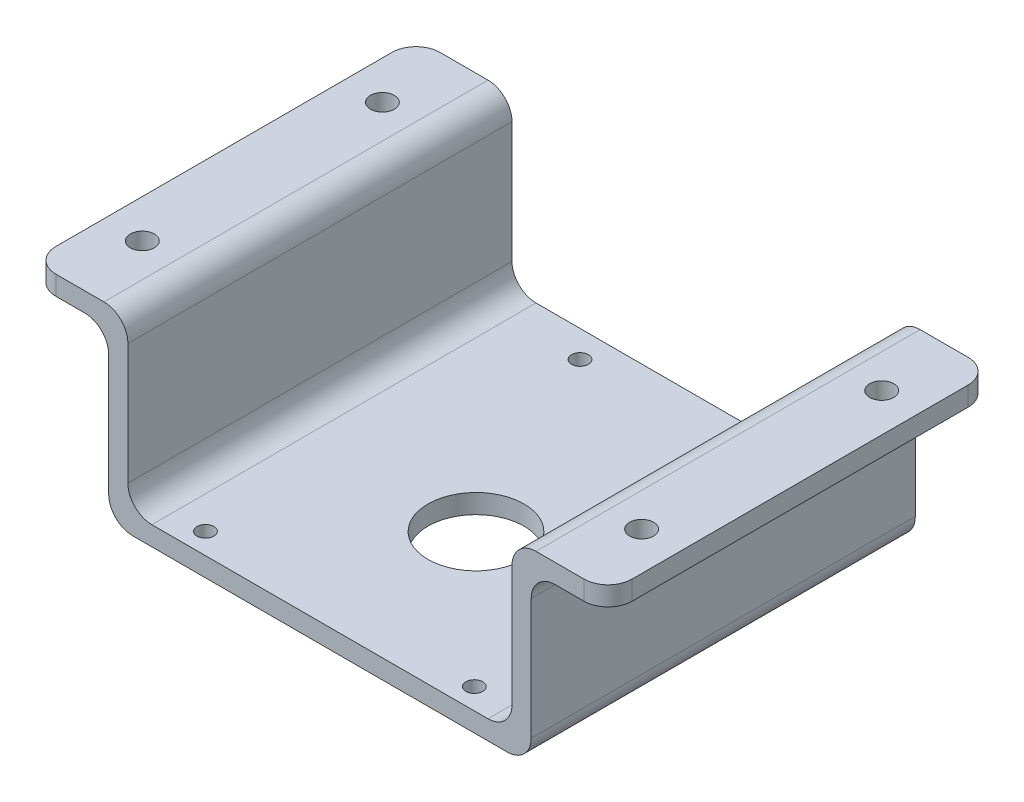
ISO-10303-21;
HEADER;
FILE_DESCRIPTION(('STEP AP214'),'2;1');
FILE_NAME('part.step','',(''),(''),'','','');
FILE_SCHEMA(('AUTOMOTIVE_DESIGN { 1 0 10303 214 1 1 1 1 }'));
ENDSEC;
DATA;
#1=APPLICATION_CONTEXT('core data for automotive mechanical design processes');
#2=APPLICATION_PROTOCOL_DEFINITION('international standard','automotive_design',2000,#1);
#3=PRODUCT_CONTEXT('',#1,'mechanical');
#4=PRODUCT('Part','Part','',(#3));
#5=PRODUCT_RELATED_PRODUCT_CATEGORY('part','',(#4));
#6=PRODUCT_DEFINITION_FORMATION('','',#4);
#7=PRODUCT_DEFINITION_CONTEXT('part definition',#1,'design');
#8=PRODUCT_DEFINITION('design','',#6,#7);
#9=PRODUCT_DEFINITION_SHAPE('','',#8);
#10=(LENGTH_UNIT() NAMED_UNIT(*) SI_UNIT(.MILLI.,.METRE.));
#11=(NAMED_UNIT(*) PLANE_ANGLE_UNIT() SI_UNIT($,.RADIAN.));
#12=(NAMED_UNIT(*) SI_UNIT($,.STERADIAN.) SOLID_ANGLE_UNIT());
#13=UNCERTAINTY_MEASURE_WITH_UNIT(LENGTH_MEASURE(1.E-05),#10,'distance_accuracy_value','');
#14=(GEOMETRIC_REPRESENTATION_CONTEXT(3) GLOBAL_UNCERTAINTY_ASSIGNED_CONTEXT((#13)) GLOBAL_UNIT_ASSIGNED_CONTEXT((#10,
#11,#12)) REPRESENTATION_CONTEXT('',''));
#15=CARTESIAN_POINT('',(0.,0.,0.));
#16=DIRECTION('',(0.,0.,1.));
#17=DIRECTION('',(1.,0.,0.));
#18=AXIS2_PLACEMENT_3D('',#15,#16,#17);
#19=CARTESIAN_POINT('',(40.,4.,40.));
#20=DIRECTION('',(0.,0.,-1.));
#21=DIRECTION('',(-1.,0.,0.));
#22=AXIS2_PLACEMENT_3D('',#19,#20,#21);
#23=PLANE('',#22);
#24=DIRECTION('',(-1.,0.,0.));
#25=VECTOR('',#24,1.);
#26=CARTESIAN_POINT('',(44.,39.2,40.));
#27=LINE('',#26,#25);
#28=CARTESIAN_POINT('',(55.,39.2,40.));
#29=VERTEX_POINT('',#28);
#30=CARTESIAN_POINT('',(45.,39.2,40.));
#31=VERTEX_POINT('',#30);
#32=EDGE_CURVE('E410',#29,#31,#27,.T.);
#33=ORIENTED_EDGE('',*,*,#32,.T.);
#34=CARTESIAN_POINT('',(45.,34.2,40.));
#35=DIRECTION('',(0.,0.,-1.));
#36=DIRECTION('',(-1.,0.,0.));
#37=AXIS2_PLACEMENT_3D('',#34,#35,#36);
#38=CIRCLE('',#37,5.);
#39=CARTESIAN_POINT('',(40.,34.2,40.));
#40=VERTEX_POINT('',#39);
#41=EDGE_CURVE('E329',#31,#40,#38,.F.);
#42=ORIENTED_EDGE('',*,*,#41,.T.);
#43=DIRECTION('',(0.,1.,0.));
#44=VECTOR('',#43,1.);
#45=CARTESIAN_POINT('',(40.,0.,40.));
#46=LINE('',#45,#44);
#47=CARTESIAN_POINT('',(40.,9.,40.));
#48=VERTEX_POINT('',#47);
#49=EDGE_CURVE('E399',#48,#40,#46,.T.);
#50=ORIENTED_EDGE('',*,*,#49,.F.);
#51=CARTESIAN_POINT('',(35.,9.,40.));
#52=DIRECTION('',(0.,0.,-1.));
#53=DIRECTION('',(-1.,0.,0.));
#54=AXIS2_PLACEMENT_3D('',#51,#52,#53);
#55=CIRCLE('',#54,5.);
#56=CARTESIAN_POINT('',(35.,4.,40.));
#57=VERTEX_POINT('',#56);
#58=EDGE_CURVE('E368',#48,#57,#55,.T.);
#59=ORIENTED_EDGE('',*,*,#58,.T.);
#60=DIRECTION('',(1.,0.,0.));
#61=VECTOR('',#60,1.);
#62=CARTESIAN_POINT('',(40.,4.,40.));
#63=LINE('',#62,#61);
#64=CARTESIAN_POINT('',(-35.,4.,40.));
#65=VERTEX_POINT('',#64);
#66=EDGE_CURVE('E261',#65,#57,#63,.T.);
#67=ORIENTED_EDGE('',*,*,#66,.F.);
#68=CARTESIAN_POINT('',(-35.,9.,40.));
#69=DIRECTION('',(0.,0.,-1.));
#70=DIRECTION('',(-1.,0.,0.));
#71=AXIS2_PLACEMENT_3D('',#68,#69,#70);
#72=CIRCLE('',#71,5.);
#73=CARTESIAN_POINT('',(-40.,9.,40.));
#74=VERTEX_POINT('',#73);
#75=EDGE_CURVE('E40',#65,#74,#72,.T.);
#76=ORIENTED_EDGE('',*,*,#75,.T.);
#77=DIRECTION('',(0.,1.,0.));
#78=VECTOR('',#77,1.);
#79=CARTESIAN_POINT('',(-40.,0.,40.));
#80=LINE('',#79,#78);
#81=CARTESIAN_POINT('',(-40.,34.2,40.));
#82=VERTEX_POINT('',#81);
#83=EDGE_CURVE('E228',#74,#82,#80,.T.);
#84=ORIENTED_EDGE('',*,*,#83,.T.);
#85=CARTESIAN_POINT('',(-45.,34.2,40.));
#86=DIRECTION('',(0.,0.,-1.));
#87=DIRECTION('',(-1.,0.,0.));
#88=AXIS2_PLACEMENT_3D('',#85,#86,#87);
#89=CIRCLE('',#88,5.);
#90=CARTESIAN_POINT('',(-45.,39.2,40.));
#91=VERTEX_POINT('',#90);
#92=EDGE_CURVE('E204',#82,#91,#89,.F.);
#93=ORIENTED_EDGE('',*,*,#92,.T.);
#94=DIRECTION('',(1.,0.,0.));
#95=VECTOR('',#94,1.);
#96=CARTESIAN_POINT('',(-44.,39.2,40.));
#97=LINE('',#96,#95);
#98=CARTESIAN_POINT('',(-55.,39.2,40.));
#99=VERTEX_POINT('',#98);
#100=EDGE_CURVE('E226',#99,#91,#97,.T.);
#101=ORIENTED_EDGE('',*,*,#100,.F.);
#102=DIRECTION('',(0.,1.,0.));
#103=VECTOR('',#102,1.);
#104=CARTESIAN_POINT('',(-55.,35.2,40.));
#105=LINE('',#104,#103);
#106=CARTESIAN_POINT('',(-55.,35.2,40.));
#107=VERTEX_POINT('',#106);
#108=EDGE_CURVE('E322',#99,#107,#105,.F.);
#109=ORIENTED_EDGE('',*,*,#108,.T.);
#110=DIRECTION('',(1.,0.,0.));
#111=VECTOR('',#110,1.);
#112=CARTESIAN_POINT('',(-40.,35.2,40.));
#113=LINE('',#112,#111);
#114=CARTESIAN_POINT('',(-49.,35.2,40.));
#115=VERTEX_POINT('',#114);
#116=EDGE_CURVE('E400',#107,#115,#113,.T.);
#117=ORIENTED_EDGE('',*,*,#116,.T.);
#118=CARTESIAN_POINT('',(-49.,30.2,40.));
#119=DIRECTION('',(0.,0.,-1.));
#120=DIRECTION('',(-1.,0.,0.));
#121=AXIS2_PLACEMENT_3D('',#118,#119,#120);
#122=CIRCLE('',#121,5.);
#123=CARTESIAN_POINT('',(-44.,30.2,40.));
#124=VERTEX_POINT('',#123);
#125=EDGE_CURVE('E222',#115,#124,#122,.T.);
#126=ORIENTED_EDGE('',*,*,#125,.T.);
#127=DIRECTION('',(0.,1.,0.));
#128=VECTOR('',#127,1.);
#129=CARTESIAN_POINT('',(-44.,0.,40.));
#130=LINE('',#129,#128);
#131=CARTESIAN_POINT('',(-44.,5.,40.));
#132=VERTEX_POINT('',#131);
#133=EDGE_CURVE('E212',#132,#124,#130,.T.);
#134=ORIENTED_EDGE('',*,*,#133,.F.);
#135=CARTESIAN_POINT('',(-39.,5.,40.));
#136=DIRECTION('',(0.,0.,-1.));
#137=DIRECTION('',(-1.,0.,0.));
#138=AXIS2_PLACEMENT_3D('',#135,#136,#137);
#139=CIRCLE('',#138,5.);
#140=CARTESIAN_POINT('',(-39.,0.,40.));
#141=VERTEX_POINT('',#140);
#142=EDGE_CURVE('E194',#132,#141,#139,.F.);
#143=ORIENTED_EDGE('',*,*,#142,.T.);
#144=DIRECTION('',(1.,0.,0.));
#145=VECTOR('',#144,1.);
#146=CARTESIAN_POINT('',(40.,0.,40.));
#147=LINE('',#146,#145);
#148=CARTESIAN_POINT('',(39.,0.,40.));
#149=VERTEX_POINT('',#148);
#150=EDGE_CURVE('E256',#141,#149,#147,.T.);
#151=ORIENTED_EDGE('',*,*,#150,.T.);
#152=CARTESIAN_POINT('',(39.,5.,40.));
#153=DIRECTION('',(0.,0.,-1.));
#154=DIRECTION('',(-1.,0.,0.));
#155=AXIS2_PLACEMENT_3D('',#152,#153,#154);
#156=CIRCLE('',#155,5.);
#157=CARTESIAN_POINT('',(44.,5.,40.));
#158=VERTEX_POINT('',#157);
#159=EDGE_CURVE('E205',#149,#158,#156,.F.);
#160=ORIENTED_EDGE('',*,*,#159,.T.);
#161=DIRECTION('',(0.,1.,0.));
#162=VECTOR('',#161,1.);
#163=CARTESIAN_POINT('',(44.,0.,40.));
#164=LINE('',#163,#162);
#165=CARTESIAN_POINT('',(44.,30.2,40.));
#166=VERTEX_POINT('',#165);
#167=EDGE_CURVE('E407',#158,#166,#164,.T.);
#168=ORIENTED_EDGE('',*,*,#167,.T.);
#169=CARTESIAN_POINT('',(49.,30.2,40.));
#170=DIRECTION('',(0.,0.,-1.));
#171=DIRECTION('',(-1.,0.,0.));
#172=AXIS2_PLACEMENT_3D('',#169,#170,#171);
#173=CIRCLE('',#172,5.);
#174=CARTESIAN_POINT('',(49.,35.2,40.));
#175=VERTEX_POINT('',#174);
#176=EDGE_CURVE('E362',#166,#175,#173,.T.);
#177=ORIENTED_EDGE('',*,*,#176,.T.);
#178=DIRECTION('',(-1.,0.,0.));
#179=VECTOR('',#178,1.);
#180=CARTESIAN_POINT('',(40.,35.2,40.));
#181=LINE('',#180,#179);
#182=CARTESIAN_POINT('',(55.,35.2,40.));
#183=VERTEX_POINT('',#182);
#184=EDGE_CURVE('E433',#183,#175,#181,.T.);
#185=ORIENTED_EDGE('',*,*,#184,.F.);
#186=DIRECTION('',(0.,1.,0.));
#187=VECTOR('',#186,1.);
#188=CARTESIAN_POINT('',(55.,4.,40.));
#189=LINE('',#188,#187);
#190=EDGE_CURVE('E324',#183,#29,#189,.T.);
#191=ORIENTED_EDGE('',*,*,#190,.T.);
#192=EDGE_LOOP('',(#33,#42,#50,#59,#67,#76,#84,#93,#101,#109,#117,#126,#134,#143,#151,#160,#168,
#177,#185,#191));
#193=FACE_BOUND('',#192,.T.);
#194=ADVANCED_FACE('F32',(#193),#23,.F.);
#195=CARTESIAN_POINT('',(40.,4.,-40.));
#196=DIRECTION('',(0.,0.,1.));
#197=DIRECTION('',(1.,0.,0.));
#198=AXIS2_PLACEMENT_3D('',#195,#196,#197);
#199=PLANE('',#198);
#200=DIRECTION('',(0.,-1.,0.));
#201=VECTOR('',#200,1.);
#202=CARTESIAN_POINT('',(40.,0.,-40.));
#203=LINE('',#202,#201);
#204=CARTESIAN_POINT('',(40.,34.2,-40.));
#205=VERTEX_POINT('',#204);
#206=CARTESIAN_POINT('',(40.,9.,-40.));
#207=VERTEX_POINT('',#206);
#208=EDGE_CURVE('E393',#205,#207,#203,.T.);
#209=ORIENTED_EDGE('',*,*,#208,.F.);
#210=CARTESIAN_POINT('',(45.,34.2,-40.));
#211=DIRECTION('',(0.,0.,1.));
#212=DIRECTION('',(1.,0.,0.));
#213=AXIS2_PLACEMENT_3D('',#210,#211,#212);
#214=CIRCLE('',#213,5.);
#215=CARTESIAN_POINT('',(45.,39.2,-40.));
#216=VERTEX_POINT('',#215);
#217=EDGE_CURVE('E314',#205,#216,#214,.F.);
#218=ORIENTED_EDGE('',*,*,#217,.T.);
#219=DIRECTION('',(-1.,0.,0.));
#220=VECTOR('',#219,1.);
#221=CARTESIAN_POINT('',(44.,39.2,-40.));
#222=LINE('',#221,#220);
#223=CARTESIAN_POINT('',(55.,39.2,-40.));
#224=VERTEX_POINT('',#223);
#225=EDGE_CURVE('E235',#224,#216,#222,.T.);
#226=ORIENTED_EDGE('',*,*,#225,.F.);
#227=DIRECTION('',(0.,1.,0.));
#228=VECTOR('',#227,1.);
#229=CARTESIAN_POINT('',(55.,4.,-40.));
#230=LINE('',#229,#228);
#231=CARTESIAN_POINT('',(55.,35.2,-40.));
#232=VERTEX_POINT('',#231);
#233=EDGE_CURVE('E306',#224,#232,#230,.F.);
#234=ORIENTED_EDGE('',*,*,#233,.T.);
#235=DIRECTION('',(1.,0.,0.));
#236=VECTOR('',#235,1.);
#237=CARTESIAN_POINT('',(40.,35.2,-40.));
#238=LINE('',#237,#236);
#239=CARTESIAN_POINT('',(49.,35.2,-40.));
#240=VERTEX_POINT('',#239);
#241=EDGE_CURVE('E445',#240,#232,#238,.T.);
#242=ORIENTED_EDGE('',*,*,#241,.F.);
#243=CARTESIAN_POINT('',(49.,30.2,-40.));
#244=DIRECTION('',(0.,0.,1.));
#245=DIRECTION('',(1.,0.,0.));
#246=AXIS2_PLACEMENT_3D('',#243,#244,#245);
#247=CIRCLE('',#246,5.);
#248=CARTESIAN_POINT('',(44.,30.2,-40.));
#249=VERTEX_POINT('',#248);
#250=EDGE_CURVE('E364',#240,#249,#247,.T.);
#251=ORIENTED_EDGE('',*,*,#250,.T.);
#252=DIRECTION('',(0.,-1.,0.));
#253=VECTOR('',#252,1.);
#254=CARTESIAN_POINT('',(44.,0.,-40.));
#255=LINE('',#254,#253);
#256=CARTESIAN_POINT('',(44.,5.,-40.));
#257=VERTEX_POINT('',#256);
#258=EDGE_CURVE('E402',#249,#257,#255,.T.);
#259=ORIENTED_EDGE('',*,*,#258,.T.);
#260=CARTESIAN_POINT('',(39.,5.,-40.));
#261=DIRECTION('',(0.,0.,1.));
#262=DIRECTION('',(1.,0.,0.));
#263=AXIS2_PLACEMENT_3D('',#260,#261,#262);
#264=CIRCLE('',#263,5.);
#265=CARTESIAN_POINT('',(39.,0.,-40.));
#266=VERTEX_POINT('',#265);
#267=EDGE_CURVE('E308',#257,#266,#264,.F.);
#268=ORIENTED_EDGE('',*,*,#267,.T.);
#269=DIRECTION('',(-1.,0.,0.));
#270=VECTOR('',#269,1.);
#271=CARTESIAN_POINT('',(40.,0.,-40.));
#272=LINE('',#271,#270);
#273=CARTESIAN_POINT('',(-39.,0.,-40.));
#274=VERTEX_POINT('',#273);
#275=EDGE_CURVE('E264',#266,#274,#272,.T.);
#276=ORIENTED_EDGE('',*,*,#275,.T.);
#277=CARTESIAN_POINT('',(-39.,5.,-40.));
#278=DIRECTION('',(0.,0.,1.));
#279=DIRECTION('',(1.,0.,0.));
#280=AXIS2_PLACEMENT_3D('',#277,#278,#279);
#281=CIRCLE('',#280,5.);
#282=CARTESIAN_POINT('',(-44.,5.,-40.));
#283=VERTEX_POINT('',#282);
#284=EDGE_CURVE('E310',#274,#283,#281,.F.);
#285=ORIENTED_EDGE('',*,*,#284,.T.);
#286=DIRECTION('',(0.,-1.,0.));
#287=VECTOR('',#286,1.);
#288=CARTESIAN_POINT('',(-44.,0.,-40.));
#289=LINE('',#288,#287);
#290=CARTESIAN_POINT('',(-44.,30.2,-40.));
#291=VERTEX_POINT('',#290);
#292=EDGE_CURVE('E215',#291,#283,#289,.T.);
#293=ORIENTED_EDGE('',*,*,#292,.F.);
#294=CARTESIAN_POINT('',(-49.,30.2,-40.));
#295=DIRECTION('',(0.,0.,1.));
#296=DIRECTION('',(1.,0.,0.));
#297=AXIS2_PLACEMENT_3D('',#294,#295,#296);
#298=CIRCLE('',#297,5.);
#299=CARTESIAN_POINT('',(-49.,35.2,-40.));
#300=VERTEX_POINT('',#299);
#301=EDGE_CURVE('E359',#291,#300,#298,.T.);
#302=ORIENTED_EDGE('',*,*,#301,.T.);
#303=DIRECTION('',(-1.,0.,0.));
#304=VECTOR('',#303,1.);
#305=CARTESIAN_POINT('',(-40.,35.2,-40.));
#306=LINE('',#305,#304);
#307=CARTESIAN_POINT('',(-55.,35.2,-40.));
#308=VERTEX_POINT('',#307);
#309=EDGE_CURVE('E454',#300,#308,#306,.T.);
#310=ORIENTED_EDGE('',*,*,#309,.T.);
#311=DIRECTION('',(0.,1.,0.));
#312=VECTOR('',#311,1.);
#313=CARTESIAN_POINT('',(-55.,39.2,-40.));
#314=LINE('',#313,#312);
#315=CARTESIAN_POINT('',(-55.,39.2,-40.));
#316=VERTEX_POINT('',#315);
#317=EDGE_CURVE('E303',#308,#316,#314,.T.);
#318=ORIENTED_EDGE('',*,*,#317,.T.);
#319=DIRECTION('',(1.,0.,0.));
#320=VECTOR('',#319,1.);
#321=CARTESIAN_POINT('',(-44.,39.2,-40.));
#322=LINE('',#321,#320);
#323=CARTESIAN_POINT('',(-45.,39.2,-40.));
#324=VERTEX_POINT('',#323);
#325=EDGE_CURVE('E223',#316,#324,#322,.T.);
#326=ORIENTED_EDGE('',*,*,#325,.T.);
#327=CARTESIAN_POINT('',(-45.,34.2,-40.));
#328=DIRECTION('',(0.,0.,1.));
#329=DIRECTION('',(1.,0.,0.));
#330=AXIS2_PLACEMENT_3D('',#327,#328,#329);
#331=CIRCLE('',#330,5.);
#332=CARTESIAN_POINT('',(-40.,34.2,-40.));
#333=VERTEX_POINT('',#332);
#334=EDGE_CURVE('E312',#324,#333,#331,.F.);
#335=ORIENTED_EDGE('',*,*,#334,.T.);
#336=DIRECTION('',(0.,-1.,0.));
#337=VECTOR('',#336,1.);
#338=CARTESIAN_POINT('',(-40.,0.,-40.));
#339=LINE('',#338,#337);
#340=CARTESIAN_POINT('',(-40.,9.,-40.));
#341=VERTEX_POINT('',#340);
#342=EDGE_CURVE('E232',#333,#341,#339,.T.);
#343=ORIENTED_EDGE('',*,*,#342,.T.);
#344=CARTESIAN_POINT('',(-35.,9.,-40.));
#345=DIRECTION('',(0.,0.,1.));
#346=DIRECTION('',(1.,0.,0.));
#347=AXIS2_PLACEMENT_3D('',#344,#345,#346);
#348=CIRCLE('',#347,5.);
#349=CARTESIAN_POINT('',(-35.,4.,-40.));
#350=VERTEX_POINT('',#349);
#351=EDGE_CURVE('E11',#341,#350,#348,.T.);
#352=ORIENTED_EDGE('',*,*,#351,.T.);
#353=DIRECTION('',(-1.,0.,0.));
#354=VECTOR('',#353,1.);
#355=CARTESIAN_POINT('',(40.,4.,-40.));
#356=LINE('',#355,#354);
#357=CARTESIAN_POINT('',(35.,4.,-40.));
#358=VERTEX_POINT('',#357);
#359=EDGE_CURVE('E217',#358,#350,#356,.T.);
#360=ORIENTED_EDGE('',*,*,#359,.F.);
#361=CARTESIAN_POINT('',(35.,9.,-40.));
#362=DIRECTION('',(0.,0.,1.));
#363=DIRECTION('',(1.,0.,0.));
#364=AXIS2_PLACEMENT_3D('',#361,#362,#363);
#365=CIRCLE('',#364,5.);
#366=EDGE_CURVE('E366',#358,#207,#365,.T.);
#367=ORIENTED_EDGE('',*,*,#366,.T.);
#368=EDGE_LOOP('',(#209,#218,#226,#234,#242,#251,#259,#268,#276,#285,#293,#302,#310,#318,#326,
#335,#343,#352,#360,#367));
#369=FACE_BOUND('',#368,.T.);
#370=ADVANCED_FACE('F384',(#369),#199,.F.);
#371=CARTESIAN_POINT('',(0.,4.,0.));
#372=DIRECTION('',(0.,1.,0.));
#373=DIRECTION('',(0.,0.,1.));
#374=AXIS2_PLACEMENT_3D('',#371,#372,#373);
#375=PLANE('',#374);
#376=CARTESIAN_POINT('',(-28.2318668819418,4.,35.6121843972086));
#377=DIRECTION('',(0.,1.,0.));
#378=DIRECTION('',(0.,0.,1.));
#379=AXIS2_PLACEMENT_3D('',#376,#377,#378);
#380=CIRCLE('',#379,1.75);
#381=CARTESIAN_POINT('',(-28.2318668819418,4.,37.3621843972086));
#382=VERTEX_POINT('',#381);
#383=EDGE_CURVE('E241',#382,#382,#380,.T.);
#384=ORIENTED_EDGE('',*,*,#383,.F.);
#385=EDGE_LOOP('',(#384));
#386=FACE_BOUND('',#385,.T.);
#387=CARTESIAN_POINT('',(27.7681331180582,4.,35.6121843972084));
#388=DIRECTION('',(0.,1.,0.));
#389=DIRECTION('',(0.,0.,1.));
#390=AXIS2_PLACEMENT_3D('',#387,#388,#389);
#391=CIRCLE('',#390,1.75);
#392=CARTESIAN_POINT('',(27.7681331180582,4.,37.3621843972084));
#393=VERTEX_POINT('',#392);
#394=EDGE_CURVE('E245',#393,#393,#391,.T.);
#395=ORIENTED_EDGE('',*,*,#394,.F.);
#396=EDGE_LOOP('',(#395));
#397=FACE_BOUND('',#396,.T.);
#398=CARTESIAN_POINT('',(19.768133118058,4.,-34.3878156027906));
#399=DIRECTION('',(0.,1.,0.));
#400=DIRECTION('',(0.,0.,1.));
#401=AXIS2_PLACEMENT_3D('',#398,#399,#400);
#402=CIRCLE('',#401,1.75);
#403=CARTESIAN_POINT('',(19.768133118058,4.,-32.6378156027906));
#404=VERTEX_POINT('',#403);
#405=EDGE_CURVE('E248',#404,#404,#402,.T.);
#406=ORIENTED_EDGE('',*,*,#405,.F.);
#407=EDGE_LOOP('',(#406));
#408=FACE_BOUND('',#407,.T.);
#409=CARTESIAN_POINT('',(-20.231866881942,4.,-34.3878156027904));
#410=DIRECTION('',(0.,1.,0.));
#411=DIRECTION('',(0.,0.,1.));
#412=AXIS2_PLACEMENT_3D('',#409,#410,#411);
#413=CIRCLE('',#412,1.75);
#414=CARTESIAN_POINT('',(-20.231866881942,4.,-32.6378156027904));
#415=VERTEX_POINT('',#414);
#416=EDGE_CURVE('E240',#415,#415,#413,.T.);
#417=ORIENTED_EDGE('',*,*,#416,.F.);
#418=EDGE_LOOP('',(#417));
#419=FACE_BOUND('',#418,.T.);
#420=CARTESIAN_POINT('',(0.,4.,7.5));
#421=DIRECTION('',(0.,1.,0.));
#422=DIRECTION('',(0.,0.,1.));
#423=AXIS2_PLACEMENT_3D('',#420,#421,#422);
#424=CIRCLE('',#423,10.);
#425=CARTESIAN_POINT('',(0.,4.,17.5));
#426=VERTEX_POINT('',#425);
#427=EDGE_CURVE('E257',#426,#426,#424,.T.);
#428=ORIENTED_EDGE('',*,*,#427,.F.);
#429=EDGE_LOOP('',(#428));
#430=FACE_BOUND('',#429,.T.);
#431=ORIENTED_EDGE('',*,*,#66,.T.);
#432=DIRECTION('',(0.,0.,-1.));
#433=VECTOR('',#432,1.);
#434=CARTESIAN_POINT('',(35.,4.,-40.));
#435=LINE('',#434,#433);
#436=EDGE_CURVE('E347',#57,#358,#435,.T.);
#437=ORIENTED_EDGE('',*,*,#436,.T.);
#438=ORIENTED_EDGE('',*,*,#359,.T.);
#439=DIRECTION('',(0.,0.,1.));
#440=VECTOR('',#439,1.);
#441=CARTESIAN_POINT('',(-35.,4.,40.));
#442=LINE('',#441,#440);
#443=EDGE_CURVE('E344',#350,#65,#442,.T.);
#444=ORIENTED_EDGE('',*,*,#443,.T.);
#445=EDGE_LOOP('',(#431,#437,#438,#444));
#446=FACE_BOUND('',#445,.T.);
#447=ADVANCED_FACE('F386',(#386,#397,#408,#419,#430,#446),#375,.T.);
#448=CARTESIAN_POINT('',(0.,0.,0.));
#449=DIRECTION('',(0.,1.,0.));
#450=DIRECTION('',(0.,0.,1.));
#451=AXIS2_PLACEMENT_3D('',#448,#449,#450);
#452=PLANE('',#451);
#453=CARTESIAN_POINT('',(-28.2318668819418,0.,35.6121843972086));
#454=DIRECTION('',(0.,1.,0.));
#455=DIRECTION('',(0.,0.,1.));
#456=AXIS2_PLACEMENT_3D('',#453,#454,#455);
#457=CIRCLE('',#456,1.75);
#458=CARTESIAN_POINT('',(-28.2318668819418,0.,37.3621843972086));
#459=VERTEX_POINT('',#458);
#460=EDGE_CURVE('E260',#459,#459,#457,.T.);
#461=ORIENTED_EDGE('',*,*,#460,.T.);
#462=EDGE_LOOP('',(#461));
#463=FACE_BOUND('',#462,.T.);
#464=CARTESIAN_POINT('',(27.7681331180582,0.,35.6121843972084));
#465=DIRECTION('',(0.,1.,0.));
#466=DIRECTION('',(0.,0.,1.));
#467=AXIS2_PLACEMENT_3D('',#464,#465,#466);
#468=CIRCLE('',#467,1.75);
#469=CARTESIAN_POINT('',(27.7681331180582,0.,37.3621843972084));
#470=VERTEX_POINT('',#469);
#471=EDGE_CURVE('E275',#470,#470,#468,.T.);
#472=ORIENTED_EDGE('',*,*,#471,.T.);
#473=EDGE_LOOP('',(#472));
#474=FACE_BOUND('',#473,.T.);
#475=CARTESIAN_POINT('',(19.768133118058,0.,-34.3878156027906));
#476=DIRECTION('',(0.,1.,0.));
#477=DIRECTION('',(0.,0.,1.));
#478=AXIS2_PLACEMENT_3D('',#475,#476,#477);
#479=CIRCLE('',#478,1.75);
#480=CARTESIAN_POINT('',(19.768133118058,0.,-32.6378156027906));
#481=VERTEX_POINT('',#480);
#482=EDGE_CURVE('E272',#481,#481,#479,.T.);
#483=ORIENTED_EDGE('',*,*,#482,.T.);
#484=EDGE_LOOP('',(#483));
#485=FACE_BOUND('',#484,.T.);
#486=CARTESIAN_POINT('',(-20.231866881942,0.,-34.3878156027904));
#487=DIRECTION('',(0.,1.,0.));
#488=DIRECTION('',(0.,0.,1.));
#489=AXIS2_PLACEMENT_3D('',#486,#487,#488);
#490=CIRCLE('',#489,1.75);
#491=CARTESIAN_POINT('',(-20.231866881942,0.,-32.6378156027904));
#492=VERTEX_POINT('',#491);
#493=EDGE_CURVE('E244',#492,#492,#490,.T.);
#494=ORIENTED_EDGE('',*,*,#493,.T.);
#495=EDGE_LOOP('',(#494));
#496=FACE_BOUND('',#495,.T.);
#497=CARTESIAN_POINT('',(0.,0.,7.5));
#498=DIRECTION('',(0.,1.,0.));
#499=DIRECTION('',(0.,0.,1.));
#500=AXIS2_PLACEMENT_3D('',#497,#498,#499);
#501=CIRCLE('',#500,10.);
#502=CARTESIAN_POINT('',(0.,0.,17.5));
#503=VERTEX_POINT('',#502);
#504=EDGE_CURVE('E253',#503,#503,#501,.T.);
#505=ORIENTED_EDGE('',*,*,#504,.T.);
#506=EDGE_LOOP('',(#505));
#507=FACE_BOUND('',#506,.T.);
#508=ORIENTED_EDGE('',*,*,#150,.F.);
#509=DIRECTION('',(0.,0.,1.));
#510=VECTOR('',#509,1.);
#511=CARTESIAN_POINT('',(-39.,0.,0.));
#512=LINE('',#511,#510);
#513=EDGE_CURVE('E199',#141,#274,#512,.F.);
#514=ORIENTED_EDGE('',*,*,#513,.T.);
#515=ORIENTED_EDGE('',*,*,#275,.F.);
#516=DIRECTION('',(0.,0.,1.));
#517=VECTOR('',#516,1.);
#518=CARTESIAN_POINT('',(39.,0.,0.));
#519=LINE('',#518,#517);
#520=EDGE_CURVE('E340',#266,#149,#519,.T.);
#521=ORIENTED_EDGE('',*,*,#520,.T.);
#522=EDGE_LOOP('',(#508,#514,#515,#521));
#523=FACE_BOUND('',#522,.T.);
#524=ADVANCED_FACE('F472',(#463,#474,#485,#496,#507,#523),#452,.F.);
#525=CARTESIAN_POINT('',(0.,0.,7.5));
#526=DIRECTION('',(0.,1.,0.));
#527=DIRECTION('',(0.,0.,1.));
#528=AXIS2_PLACEMENT_3D('',#525,#526,#527);
#529=CYLINDRICAL_SURFACE('',#528,10.);
#530=ORIENTED_EDGE('',*,*,#504,.F.);
#531=EDGE_LOOP('',(#530));
#532=FACE_BOUND('',#531,.T.);
#533=ORIENTED_EDGE('',*,*,#427,.T.);
#534=EDGE_LOOP('',(#533));
#535=FACE_BOUND('',#534,.T.);
#536=ADVANCED_FACE('F474',(#532,#535),#529,.F.);
#537=CARTESIAN_POINT('',(-20.231866881942,-6.,-34.3878156027904));
#538=DIRECTION('',(0.,1.,0.));
#539=DIRECTION('',(0.,0.,1.));
#540=AXIS2_PLACEMENT_3D('',#537,#538,#539);
#541=CYLINDRICAL_SURFACE('',#540,1.75);
#542=ORIENTED_EDGE('',*,*,#416,.T.);
#543=EDGE_LOOP('',(#542));
#544=FACE_BOUND('',#543,.T.);
#545=ORIENTED_EDGE('',*,*,#493,.F.);
#546=EDGE_LOOP('',(#545));
#547=FACE_BOUND('',#546,.T.);
#548=ADVANCED_FACE('F481',(#544,#547),#541,.F.);
#549=CARTESIAN_POINT('',(19.768133118058,-6.,-34.3878156027906));
#550=DIRECTION('',(0.,1.,0.));
#551=DIRECTION('',(0.,0.,1.));
#552=AXIS2_PLACEMENT_3D('',#549,#550,#551);
#553=CYLINDRICAL_SURFACE('',#552,1.75);
#554=ORIENTED_EDGE('',*,*,#405,.T.);
#555=EDGE_LOOP('',(#554));
#556=FACE_BOUND('',#555,.T.);
#557=ORIENTED_EDGE('',*,*,#482,.F.);
#558=EDGE_LOOP('',(#557));
#559=FACE_BOUND('',#558,.T.);
#560=ADVANCED_FACE('F562',(#556,#559),#553,.F.);
#561=CARTESIAN_POINT('',(27.7681331180582,-6.,35.6121843972084));
#562=DIRECTION('',(0.,1.,0.));
#563=DIRECTION('',(0.,0.,1.));
#564=AXIS2_PLACEMENT_3D('',#561,#562,#563);
#565=CYLINDRICAL_SURFACE('',#564,1.75);
#566=ORIENTED_EDGE('',*,*,#394,.T.);
#567=EDGE_LOOP('',(#566));
#568=FACE_BOUND('',#567,.T.);
#569=ORIENTED_EDGE('',*,*,#471,.F.);
#570=EDGE_LOOP('',(#569));
#571=FACE_BOUND('',#570,.T.);
#572=ADVANCED_FACE('F558',(#568,#571),#565,.F.);
#573=CARTESIAN_POINT('',(-28.2318668819418,-6.,35.6121843972086));
#574=DIRECTION('',(0.,1.,0.));
#575=DIRECTION('',(0.,0.,1.));
#576=AXIS2_PLACEMENT_3D('',#573,#574,#575);
#577=CYLINDRICAL_SURFACE('',#576,1.75);
#578=ORIENTED_EDGE('',*,*,#383,.T.);
#579=EDGE_LOOP('',(#578));
#580=FACE_BOUND('',#579,.T.);
#581=ORIENTED_EDGE('',*,*,#460,.F.);
#582=EDGE_LOOP('',(#581));
#583=FACE_BOUND('',#582,.T.);
#584=ADVANCED_FACE('F551',(#580,#583),#577,.F.);
#585=CARTESIAN_POINT('',(-40.,0.,0.));
#586=DIRECTION('',(1.,0.,0.));
#587=DIRECTION('',(0.,0.,-1.));
#588=AXIS2_PLACEMENT_3D('',#585,#586,#587);
#589=PLANE('',#588);
#590=ORIENTED_EDGE('',*,*,#342,.F.);
#591=DIRECTION('',(0.,0.,-1.));
#592=VECTOR('',#591,1.);
#593=CARTESIAN_POINT('',(-40.,34.2,40.));
#594=LINE('',#593,#592);
#595=EDGE_CURVE('E338',#333,#82,#594,.F.);
#596=ORIENTED_EDGE('',*,*,#595,.T.);
#597=ORIENTED_EDGE('',*,*,#83,.F.);
#598=DIRECTION('',(0.,0.,1.));
#599=VECTOR('',#598,1.);
#600=CARTESIAN_POINT('',(-40.,9.,-40.));
#601=LINE('',#600,#599);
#602=EDGE_CURVE('E336',#74,#341,#601,.F.);
#603=ORIENTED_EDGE('',*,*,#602,.T.);
#604=EDGE_LOOP('',(#590,#596,#597,#603));
#605=FACE_BOUND('',#604,.T.);
#606=ADVANCED_FACE('F377',(#605),#589,.T.);
#607=CARTESIAN_POINT('',(-44.,39.2,-40.));
#608=DIRECTION('',(0.,-1.,0.));
#609=DIRECTION('',(0.,0.,-1.));
#610=AXIS2_PLACEMENT_3D('',#607,#608,#609);
#611=PLANE('',#610);
#612=CARTESIAN_POINT('',(-52.,39.2,-25.));
#613=DIRECTION('',(0.,1.,0.));
#614=DIRECTION('',(0.,0.,-1.));
#615=AXIS2_PLACEMENT_3D('',#612,#613,#614);
#616=CIRCLE('',#615,2.5);
#617=CARTESIAN_POINT('',(-52.,39.2,-27.5));
#618=VERTEX_POINT('',#617);
#619=EDGE_CURVE('E802',#618,#618,#616,.T.);
#620=ORIENTED_EDGE('',*,*,#619,.F.);
#621=EDGE_LOOP('',(#620));
#622=FACE_BOUND('',#621,.T.);
#623=CARTESIAN_POINT('',(-52.,39.2,25.));
#624=DIRECTION('',(0.,1.,0.));
#625=DIRECTION('',(0.,0.,1.));
#626=AXIS2_PLACEMENT_3D('',#623,#624,#625);
#627=CIRCLE('',#626,2.5);
#628=CARTESIAN_POINT('',(-52.,39.2,27.5));
#629=VERTEX_POINT('',#628);
#630=EDGE_CURVE('E448',#629,#629,#627,.T.);
#631=ORIENTED_EDGE('',*,*,#630,.F.);
#632=EDGE_LOOP('',(#631));
#633=FACE_BOUND('',#632,.T.);
#634=ORIENTED_EDGE('',*,*,#100,.T.);
#635=DIRECTION('',(0.,0.,-1.));
#636=VECTOR('',#635,1.);
#637=CARTESIAN_POINT('',(-45.,39.2,-40.));
#638=LINE('',#637,#636);
#639=EDGE_CURVE('E333',#91,#324,#638,.T.);
#640=ORIENTED_EDGE('',*,*,#639,.T.);
#641=ORIENTED_EDGE('',*,*,#325,.F.);
#642=CARTESIAN_POINT('',(-55.,39.2,-35.));
#643=DIRECTION('',(0.,-1.,0.));
#644=DIRECTION('',(0.,0.,-1.));
#645=AXIS2_PLACEMENT_3D('',#642,#643,#644);
#646=CIRCLE('',#645,5.);
#647=CARTESIAN_POINT('',(-60.,39.2,-35.));
#648=VERTEX_POINT('',#647);
#649=EDGE_CURVE('E55',#316,#648,#646,.F.);
#650=ORIENTED_EDGE('',*,*,#649,.T.);
#651=DIRECTION('',(0.,0.,1.));
#652=VECTOR('',#651,1.);
#653=CARTESIAN_POINT('',(-60.,39.2,-40.));
#654=LINE('',#653,#652);
#655=CARTESIAN_POINT('',(-60.,39.2,35.));
#656=VERTEX_POINT('',#655);
#657=EDGE_CURVE('E452',#648,#656,#654,.T.);
#658=ORIENTED_EDGE('',*,*,#657,.T.);
#659=CARTESIAN_POINT('',(-55.,39.2,35.));
#660=DIRECTION('',(0.,-1.,0.));
#661=DIRECTION('',(0.,0.,-1.));
#662=AXIS2_PLACEMENT_3D('',#659,#660,#661);
#663=CIRCLE('',#662,5.);
#664=EDGE_CURVE('E47',#656,#99,#663,.F.);
#665=ORIENTED_EDGE('',*,*,#664,.T.);
#666=EDGE_LOOP('',(#634,#640,#641,#650,#658,#665));
#667=FACE_BOUND('',#666,.T.);
#668=ADVANCED_FACE('F541',(#622,#633,#667),#611,.F.);
#669=CARTESIAN_POINT('',(-44.,0.,0.));
#670=DIRECTION('',(1.,0.,0.));
#671=DIRECTION('',(0.,0.,-1.));
#672=AXIS2_PLACEMENT_3D('',#669,#670,#671);
#673=PLANE('',#672);
#674=ORIENTED_EDGE('',*,*,#133,.T.);
#675=DIRECTION('',(0.,0.,-1.));
#676=VECTOR('',#675,1.);
#677=CARTESIAN_POINT('',(-44.,30.2,0.));
#678=LINE('',#677,#676);
#679=EDGE_CURVE('E216',#124,#291,#678,.T.);
#680=ORIENTED_EDGE('',*,*,#679,.T.);
#681=ORIENTED_EDGE('',*,*,#292,.T.);
#682=DIRECTION('',(0.,0.,1.));
#683=VECTOR('',#682,1.);
#684=CARTESIAN_POINT('',(-44.,5.,0.));
#685=LINE('',#684,#683);
#686=EDGE_CURVE('E198',#283,#132,#685,.T.);
#687=ORIENTED_EDGE('',*,*,#686,.T.);
#688=EDGE_LOOP('',(#674,#680,#681,#687));
#689=FACE_BOUND('',#688,.T.);
#690=ADVANCED_FACE('F210',(#689),#673,.F.);
#691=CARTESIAN_POINT('',(40.,0.,0.));
#692=DIRECTION('',(-1.,0.,0.));
#693=DIRECTION('',(0.,0.,-1.));
#694=AXIS2_PLACEMENT_3D('',#691,#692,#693);
#695=PLANE('',#694);
#696=ORIENTED_EDGE('',*,*,#49,.T.);
#697=DIRECTION('',(0.,0.,-1.));
#698=VECTOR('',#697,1.);
#699=CARTESIAN_POINT('',(40.,34.2,0.));
#700=LINE('',#699,#698);
#701=EDGE_CURVE('E300',#40,#205,#700,.T.);
#702=ORIENTED_EDGE('',*,*,#701,.T.);
#703=ORIENTED_EDGE('',*,*,#208,.T.);
#704=DIRECTION('',(0.,0.,-1.));
#705=VECTOR('',#704,1.);
#706=CARTESIAN_POINT('',(40.,9.,40.));
#707=LINE('',#706,#705);
#708=EDGE_CURVE('E298',#207,#48,#707,.F.);
#709=ORIENTED_EDGE('',*,*,#708,.T.);
#710=EDGE_LOOP('',(#696,#702,#703,#709));
#711=FACE_BOUND('',#710,.T.);
#712=ADVANCED_FACE('F396',(#711),#695,.T.);
#713=CARTESIAN_POINT('',(44.,39.2,-40.));
#714=DIRECTION('',(0.,1.,0.));
#715=DIRECTION('',(0.,0.,1.));
#716=AXIS2_PLACEMENT_3D('',#713,#714,#715);
#717=PLANE('',#716);
#718=CARTESIAN_POINT('',(52.,39.2,25.));
#719=DIRECTION('',(0.,1.,0.));
#720=DIRECTION('',(0.,0.,-1.));
#721=AXIS2_PLACEMENT_3D('',#718,#719,#720);
#722=CIRCLE('',#721,2.5);
#723=CARTESIAN_POINT('',(52.,39.2,22.5));
#724=VERTEX_POINT('',#723);
#725=EDGE_CURVE('E805',#724,#724,#722,.T.);
#726=ORIENTED_EDGE('',*,*,#725,.F.);
#727=EDGE_LOOP('',(#726));
#728=FACE_BOUND('',#727,.T.);
#729=CARTESIAN_POINT('',(52.,39.2,-25.));
#730=DIRECTION('',(0.,1.,0.));
#731=DIRECTION('',(0.,0.,1.));
#732=AXIS2_PLACEMENT_3D('',#729,#730,#731);
#733=CIRCLE('',#732,2.5);
#734=CARTESIAN_POINT('',(52.,39.2,-22.5));
#735=VERTEX_POINT('',#734);
#736=EDGE_CURVE('E798',#735,#735,#733,.T.);
#737=ORIENTED_EDGE('',*,*,#736,.F.);
#738=EDGE_LOOP('',(#737));
#739=FACE_BOUND('',#738,.T.);
#740=ORIENTED_EDGE('',*,*,#225,.T.);
#741=DIRECTION('',(0.,0.,-1.));
#742=VECTOR('',#741,1.);
#743=CARTESIAN_POINT('',(45.,39.2,-40.));
#744=LINE('',#743,#742);
#745=EDGE_CURVE('E320',#216,#31,#744,.F.);
#746=ORIENTED_EDGE('',*,*,#745,.T.);
#747=ORIENTED_EDGE('',*,*,#32,.F.);
#748=CARTESIAN_POINT('',(55.,39.2,35.));
#749=DIRECTION('',(0.,1.,0.));
#750=DIRECTION('',(0.,0.,1.));
#751=AXIS2_PLACEMENT_3D('',#748,#749,#750);
#752=CIRCLE('',#751,5.);
#753=CARTESIAN_POINT('',(60.,39.2,35.));
#754=VERTEX_POINT('',#753);
#755=EDGE_CURVE('E316',#29,#754,#752,.T.);
#756=ORIENTED_EDGE('',*,*,#755,.T.);
#757=DIRECTION('',(0.,0.,1.));
#758=VECTOR('',#757,1.);
#759=CARTESIAN_POINT('',(60.,39.2,-40.));
#760=LINE('',#759,#758);
#761=CARTESIAN_POINT('',(60.,39.2,-35.));
#762=VERTEX_POINT('',#761);
#763=EDGE_CURVE('E425',#762,#754,#760,.T.);
#764=ORIENTED_EDGE('',*,*,#763,.F.);
#765=CARTESIAN_POINT('',(55.,39.2,-35.));
#766=DIRECTION('',(0.,1.,0.));
#767=DIRECTION('',(0.,0.,1.));
#768=AXIS2_PLACEMENT_3D('',#765,#766,#767);
#769=CIRCLE('',#768,5.);
#770=EDGE_CURVE('E318',#762,#224,#769,.T.);
#771=ORIENTED_EDGE('',*,*,#770,.T.);
#772=EDGE_LOOP('',(#740,#746,#747,#756,#764,#771));
#773=FACE_BOUND('',#772,.T.);
#774=ADVANCED_FACE('F415',(#728,#739,#773),#717,.T.);
#775=CARTESIAN_POINT('',(44.,0.,0.));
#776=DIRECTION('',(-1.,0.,0.));
#777=DIRECTION('',(0.,0.,-1.));
#778=AXIS2_PLACEMENT_3D('',#775,#776,#777);
#779=PLANE('',#778);
#780=ORIENTED_EDGE('',*,*,#258,.F.);
#781=DIRECTION('',(0.,0.,1.));
#782=VECTOR('',#781,1.);
#783=CARTESIAN_POINT('',(44.,30.2,0.));
#784=LINE('',#783,#782);
#785=EDGE_CURVE('E289',#249,#166,#784,.T.);
#786=ORIENTED_EDGE('',*,*,#785,.T.);
#787=ORIENTED_EDGE('',*,*,#167,.F.);
#788=DIRECTION('',(0.,0.,1.));
#789=VECTOR('',#788,1.);
#790=CARTESIAN_POINT('',(44.,5.,0.));
#791=LINE('',#790,#789);
#792=EDGE_CURVE('E287',#158,#257,#791,.F.);
#793=ORIENTED_EDGE('',*,*,#792,.T.);
#794=EDGE_LOOP('',(#780,#786,#787,#793));
#795=FACE_BOUND('',#794,.T.);
#796=ADVANCED_FACE('F465',(#795),#779,.F.);
#797=CARTESIAN_POINT('',(0.,35.2,0.));
#798=DIRECTION('',(0.,-1.,0.));
#799=DIRECTION('',(0.,0.,-1.));
#800=AXIS2_PLACEMENT_3D('',#797,#798,#799);
#801=PLANE('',#800);
#802=CARTESIAN_POINT('',(-52.,35.2,-25.));
#803=DIRECTION('',(0.,1.,0.));
#804=DIRECTION('',(0.,0.,-1.));
#805=AXIS2_PLACEMENT_3D('',#802,#803,#804);
#806=CIRCLE('',#805,2.5);
#807=CARTESIAN_POINT('',(-52.,35.2,-27.5));
#808=VERTEX_POINT('',#807);
#809=EDGE_CURVE('E814',#808,#808,#806,.T.);
#810=ORIENTED_EDGE('',*,*,#809,.T.);
#811=EDGE_LOOP('',(#810));
#812=FACE_BOUND('',#811,.T.);
#813=CARTESIAN_POINT('',(-52.,35.2,25.));
#814=DIRECTION('',(0.,1.,0.));
#815=DIRECTION('',(0.,0.,1.));
#816=AXIS2_PLACEMENT_3D('',#813,#814,#815);
#817=CIRCLE('',#816,2.5);
#818=CARTESIAN_POINT('',(-52.,35.2,27.5));
#819=VERTEX_POINT('',#818);
#820=EDGE_CURVE('E434',#819,#819,#817,.T.);
#821=ORIENTED_EDGE('',*,*,#820,.T.);
#822=EDGE_LOOP('',(#821));
#823=FACE_BOUND('',#822,.T.);
#824=ORIENTED_EDGE('',*,*,#309,.F.);
#825=DIRECTION('',(0.,0.,-1.));
#826=VECTOR('',#825,1.);
#827=CARTESIAN_POINT('',(-49.,35.2,0.));
#828=LINE('',#827,#826);
#829=EDGE_CURVE('E285',#300,#115,#828,.F.);
#830=ORIENTED_EDGE('',*,*,#829,.T.);
#831=ORIENTED_EDGE('',*,*,#116,.F.);
#832=CARTESIAN_POINT('',(-55.,35.2,35.));
#833=DIRECTION('',(0.,-1.,0.));
#834=DIRECTION('',(0.,0.,-1.));
#835=AXIS2_PLACEMENT_3D('',#832,#833,#834);
#836=CIRCLE('',#835,5.);
#837=CARTESIAN_POINT('',(-60.,35.2,35.));
#838=VERTEX_POINT('',#837);
#839=EDGE_CURVE('E281',#107,#838,#836,.T.);
#840=ORIENTED_EDGE('',*,*,#839,.T.);
#841=DIRECTION('',(0.,0.,1.));
#842=VECTOR('',#841,1.);
#843=CARTESIAN_POINT('',(-60.,35.2,-40.));
#844=LINE('',#843,#842);
#845=CARTESIAN_POINT('',(-60.,35.2,-35.));
#846=VERTEX_POINT('',#845);
#847=EDGE_CURVE('E404',#846,#838,#844,.T.);
#848=ORIENTED_EDGE('',*,*,#847,.F.);
#849=CARTESIAN_POINT('',(-55.,35.2,-35.));
#850=DIRECTION('',(0.,-1.,0.));
#851=DIRECTION('',(0.,0.,-1.));
#852=AXIS2_PLACEMENT_3D('',#849,#850,#851);
#853=CIRCLE('',#852,5.);
#854=EDGE_CURVE('E283',#846,#308,#853,.T.);
#855=ORIENTED_EDGE('',*,*,#854,.T.);
#856=EDGE_LOOP('',(#824,#830,#831,#840,#848,#855));
#857=FACE_BOUND('',#856,.T.);
#858=ADVANCED_FACE('F534',(#812,#823,#857),#801,.T.);
#859=CARTESIAN_POINT('',(-60.,35.2,-40.));
#860=DIRECTION('',(-1.,0.,0.));
#861=DIRECTION('',(0.,0.,1.));
#862=AXIS2_PLACEMENT_3D('',#859,#860,#861);
#863=PLANE('',#862);
#864=ORIENTED_EDGE('',*,*,#657,.F.);
#865=DIRECTION('',(0.,1.,0.));
#866=VECTOR('',#865,1.);
#867=CARTESIAN_POINT('',(-60.,35.2,-35.));
#868=LINE('',#867,#866);
#869=EDGE_CURVE('E357',#648,#846,#868,.F.);
#870=ORIENTED_EDGE('',*,*,#869,.T.);
#871=ORIENTED_EDGE('',*,*,#847,.T.);
#872=DIRECTION('',(0.,1.,0.));
#873=VECTOR('',#872,1.);
#874=CARTESIAN_POINT('',(-60.,39.2,35.));
#875=LINE('',#874,#873);
#876=EDGE_CURVE('E355',#838,#656,#875,.T.);
#877=ORIENTED_EDGE('',*,*,#876,.T.);
#878=EDGE_LOOP('',(#864,#870,#871,#877));
#879=FACE_BOUND('',#878,.T.);
#880=ADVANCED_FACE('F540',(#879),#863,.T.);
#881=CARTESIAN_POINT('',(0.,35.2,0.));
#882=DIRECTION('',(0.,-1.,0.));
#883=DIRECTION('',(0.,0.,-1.));
#884=AXIS2_PLACEMENT_3D('',#881,#882,#883);
#885=PLANE('',#884);
#886=CARTESIAN_POINT('',(52.,35.2,25.));
#887=DIRECTION('',(0.,1.,0.));
#888=DIRECTION('',(0.,0.,-1.));
#889=AXIS2_PLACEMENT_3D('',#886,#887,#888);
#890=CIRCLE('',#889,2.5);
#891=CARTESIAN_POINT('',(52.,35.2,22.5));
#892=VERTEX_POINT('',#891);
#893=EDGE_CURVE('E800',#892,#892,#890,.T.);
#894=ORIENTED_EDGE('',*,*,#893,.T.);
#895=EDGE_LOOP('',(#894));
#896=FACE_BOUND('',#895,.T.);
#897=CARTESIAN_POINT('',(52.,35.2,-25.));
#898=DIRECTION('',(0.,1.,0.));
#899=DIRECTION('',(0.,0.,1.));
#900=AXIS2_PLACEMENT_3D('',#897,#898,#899);
#901=CIRCLE('',#900,2.5);
#902=CARTESIAN_POINT('',(52.,35.2,-22.5));
#903=VERTEX_POINT('',#902);
#904=EDGE_CURVE('E795',#903,#903,#901,.T.);
#905=ORIENTED_EDGE('',*,*,#904,.T.);
#906=EDGE_LOOP('',(#905));
#907=FACE_BOUND('',#906,.T.);
#908=ORIENTED_EDGE('',*,*,#184,.T.);
#909=DIRECTION('',(0.,0.,1.));
#910=VECTOR('',#909,1.);
#911=CARTESIAN_POINT('',(49.,35.2,0.));
#912=LINE('',#911,#910);
#913=EDGE_CURVE('E296',#175,#240,#912,.F.);
#914=ORIENTED_EDGE('',*,*,#913,.T.);
#915=ORIENTED_EDGE('',*,*,#241,.T.);
#916=CARTESIAN_POINT('',(55.,35.2,-35.));
#917=DIRECTION('',(0.,-1.,0.));
#918=DIRECTION('',(0.,0.,-1.));
#919=AXIS2_PLACEMENT_3D('',#916,#917,#918);
#920=CIRCLE('',#919,5.);
#921=CARTESIAN_POINT('',(60.,35.2,-35.));
#922=VERTEX_POINT('',#921);
#923=EDGE_CURVE('E294',#232,#922,#920,.T.);
#924=ORIENTED_EDGE('',*,*,#923,.T.);
#925=DIRECTION('',(0.,0.,1.));
#926=VECTOR('',#925,1.);
#927=CARTESIAN_POINT('',(60.,35.2,-40.));
#928=LINE('',#927,#926);
#929=CARTESIAN_POINT('',(60.,35.2,35.));
#930=VERTEX_POINT('',#929);
#931=EDGE_CURVE('E442',#922,#930,#928,.T.);
#932=ORIENTED_EDGE('',*,*,#931,.T.);
#933=CARTESIAN_POINT('',(55.,35.2,35.));
#934=DIRECTION('',(0.,-1.,0.));
#935=DIRECTION('',(0.,0.,-1.));
#936=AXIS2_PLACEMENT_3D('',#933,#934,#935);
#937=CIRCLE('',#936,5.);
#938=EDGE_CURVE('E292',#930,#183,#937,.T.);
#939=ORIENTED_EDGE('',*,*,#938,.T.);
#940=EDGE_LOOP('',(#908,#914,#915,#924,#932,#939));
#941=FACE_BOUND('',#940,.T.);
#942=ADVANCED_FACE('F440',(#896,#907,#941),#885,.T.);
#943=CARTESIAN_POINT('',(60.,35.2,-40.));
#944=DIRECTION('',(-1.,0.,0.));
#945=DIRECTION('',(0.,0.,1.));
#946=AXIS2_PLACEMENT_3D('',#943,#944,#945);
#947=PLANE('',#946);
#948=ORIENTED_EDGE('',*,*,#931,.F.);
#949=DIRECTION('',(0.,1.,0.));
#950=VECTOR('',#949,1.);
#951=CARTESIAN_POINT('',(60.,35.2,-35.));
#952=LINE('',#951,#950);
#953=EDGE_CURVE('E352',#922,#762,#952,.T.);
#954=ORIENTED_EDGE('',*,*,#953,.T.);
#955=ORIENTED_EDGE('',*,*,#763,.T.);
#956=DIRECTION('',(0.,1.,0.));
#957=VECTOR('',#956,1.);
#958=CARTESIAN_POINT('',(60.,35.2,35.));
#959=LINE('',#958,#957);
#960=EDGE_CURVE('E350',#754,#930,#959,.F.);
#961=ORIENTED_EDGE('',*,*,#960,.T.);
#962=EDGE_LOOP('',(#948,#954,#955,#961));
#963=FACE_BOUND('',#962,.T.);
#964=ADVANCED_FACE('F430',(#963),#947,.F.);
#965=CARTESIAN_POINT('',(52.,35.2,-25.));
#966=DIRECTION('',(0.,1.,0.));
#967=DIRECTION('',(0.,0.,1.));
#968=AXIS2_PLACEMENT_3D('',#965,#966,#967);
#969=CYLINDRICAL_SURFACE('',#968,2.5);
#970=ORIENTED_EDGE('',*,*,#904,.F.);
#971=EDGE_LOOP('',(#970));
#972=FACE_BOUND('',#971,.T.);
#973=ORIENTED_EDGE('',*,*,#736,.T.);
#974=EDGE_LOOP('',(#973));
#975=FACE_BOUND('',#974,.T.);
#976=ADVANCED_FACE('F681',(#972,#975),#969,.F.);
#977=CARTESIAN_POINT('',(52.,35.2,25.));
#978=DIRECTION('',(0.,1.,0.));
#979=DIRECTION('',(0.,0.,1.));
#980=AXIS2_PLACEMENT_3D('',#977,#978,#979);
#981=CYLINDRICAL_SURFACE('',#980,2.5);
#982=ORIENTED_EDGE('',*,*,#893,.F.);
#983=EDGE_LOOP('',(#982));
#984=FACE_BOUND('',#983,.T.);
#985=ORIENTED_EDGE('',*,*,#725,.T.);
#986=EDGE_LOOP('',(#985));
#987=FACE_BOUND('',#986,.T.);
#988=ADVANCED_FACE('F769',(#984,#987),#981,.F.);
#989=CARTESIAN_POINT('',(-52.,35.2,25.));
#990=DIRECTION('',(0.,1.,0.));
#991=DIRECTION('',(0.,0.,1.));
#992=AXIS2_PLACEMENT_3D('',#989,#990,#991);
#993=CYLINDRICAL_SURFACE('',#992,2.5);
#994=ORIENTED_EDGE('',*,*,#820,.F.);
#995=EDGE_LOOP('',(#994));
#996=FACE_BOUND('',#995,.T.);
#997=ORIENTED_EDGE('',*,*,#630,.T.);
#998=EDGE_LOOP('',(#997));
#999=FACE_BOUND('',#998,.T.);
#1000=ADVANCED_FACE('F762',(#996,#999),#993,.F.);
#1001=CARTESIAN_POINT('',(-52.,35.2,-25.));
#1002=DIRECTION('',(0.,1.,0.));
#1003=DIRECTION('',(0.,0.,1.));
#1004=AXIS2_PLACEMENT_3D('',#1001,#1002,#1003);
#1005=CYLINDRICAL_SURFACE('',#1004,2.5);
#1006=ORIENTED_EDGE('',*,*,#809,.F.);
#1007=EDGE_LOOP('',(#1006));
#1008=FACE_BOUND('',#1007,.T.);
#1009=ORIENTED_EDGE('',*,*,#619,.T.);
#1010=EDGE_LOOP('',(#1009));
#1011=FACE_BOUND('',#1010,.T.);
#1012=ADVANCED_FACE('F498',(#1008,#1011),#1005,.F.);
#1013=CARTESIAN_POINT('',(-49.,30.2,0.));
#1014=DIRECTION('',(0.,0.,-1.));
#1015=DIRECTION('',(-1.,0.,0.));
#1016=AXIS2_PLACEMENT_3D('',#1013,#1014,#1015);
#1017=CYLINDRICAL_SURFACE('',#1016,5.);
#1018=ORIENTED_EDGE('',*,*,#125,.F.);
#1019=ORIENTED_EDGE('',*,*,#829,.F.);
#1020=ORIENTED_EDGE('',*,*,#301,.F.);
#1021=ORIENTED_EDGE('',*,*,#679,.F.);
#1022=EDGE_LOOP('',(#1018,#1019,#1020,#1021));
#1023=FACE_BOUND('',#1022,.T.);
#1024=ADVANCED_FACE('F494',(#1023),#1017,.F.);
#1025=CARTESIAN_POINT('',(49.,30.2,0.));
#1026=DIRECTION('',(0.,0.,1.));
#1027=DIRECTION('',(1.,0.,0.));
#1028=AXIS2_PLACEMENT_3D('',#1025,#1026,#1027);
#1029=CYLINDRICAL_SURFACE('',#1028,5.);
#1030=ORIENTED_EDGE('',*,*,#250,.F.);
#1031=ORIENTED_EDGE('',*,*,#913,.F.);
#1032=ORIENTED_EDGE('',*,*,#176,.F.);
#1033=ORIENTED_EDGE('',*,*,#785,.F.);
#1034=EDGE_LOOP('',(#1030,#1031,#1032,#1033));
#1035=FACE_BOUND('',#1034,.T.);
#1036=ADVANCED_FACE('F497',(#1035),#1029,.F.);
#1037=CARTESIAN_POINT('',(45.,34.2,0.));
#1038=DIRECTION('',(0.,0.,-1.));
#1039=DIRECTION('',(-1.,0.,0.));
#1040=AXIS2_PLACEMENT_3D('',#1037,#1038,#1039);
#1041=CYLINDRICAL_SURFACE('',#1040,5.);
#1042=ORIENTED_EDGE('',*,*,#41,.F.);
#1043=ORIENTED_EDGE('',*,*,#745,.F.);
#1044=ORIENTED_EDGE('',*,*,#217,.F.);
#1045=ORIENTED_EDGE('',*,*,#701,.F.);
#1046=EDGE_LOOP('',(#1042,#1043,#1044,#1045));
#1047=FACE_BOUND('',#1046,.T.);
#1048=ADVANCED_FACE('F421',(#1047),#1041,.T.);
#1049=CARTESIAN_POINT('',(-45.,34.2,-40.));
#1050=DIRECTION('',(0.,0.,1.));
#1051=DIRECTION('',(1.,0.,0.));
#1052=AXIS2_PLACEMENT_3D('',#1049,#1050,#1051);
#1053=CYLINDRICAL_SURFACE('',#1052,5.);
#1054=ORIENTED_EDGE('',*,*,#92,.F.);
#1055=ORIENTED_EDGE('',*,*,#595,.F.);
#1056=ORIENTED_EDGE('',*,*,#334,.F.);
#1057=ORIENTED_EDGE('',*,*,#639,.F.);
#1058=EDGE_LOOP('',(#1054,#1055,#1056,#1057));
#1059=FACE_BOUND('',#1058,.T.);
#1060=ADVANCED_FACE('F505',(#1059),#1053,.T.);
#1061=CARTESIAN_POINT('',(-39.,5.,0.));
#1062=DIRECTION('',(0.,0.,1.));
#1063=DIRECTION('',(1.,0.,0.));
#1064=AXIS2_PLACEMENT_3D('',#1061,#1062,#1063);
#1065=CYLINDRICAL_SURFACE('',#1064,5.);
#1066=ORIENTED_EDGE('',*,*,#284,.F.);
#1067=ORIENTED_EDGE('',*,*,#513,.F.);
#1068=ORIENTED_EDGE('',*,*,#142,.F.);
#1069=ORIENTED_EDGE('',*,*,#686,.F.);
#1070=EDGE_LOOP('',(#1066,#1067,#1068,#1069));
#1071=FACE_BOUND('',#1070,.T.);
#1072=ADVANCED_FACE('F197',(#1071),#1065,.T.);
#1073=CARTESIAN_POINT('',(39.,5.,0.));
#1074=DIRECTION('',(0.,0.,1.));
#1075=DIRECTION('',(1.,0.,0.));
#1076=AXIS2_PLACEMENT_3D('',#1073,#1074,#1075);
#1077=CYLINDRICAL_SURFACE('',#1076,5.);
#1078=ORIENTED_EDGE('',*,*,#267,.F.);
#1079=ORIENTED_EDGE('',*,*,#792,.F.);
#1080=ORIENTED_EDGE('',*,*,#159,.F.);
#1081=ORIENTED_EDGE('',*,*,#520,.F.);
#1082=EDGE_LOOP('',(#1078,#1079,#1080,#1081));
#1083=FACE_BOUND('',#1082,.T.);
#1084=ADVANCED_FACE('F468',(#1083),#1077,.T.);
#1085=CARTESIAN_POINT('',(35.,9.,0.));
#1086=DIRECTION('',(0.,0.,1.));
#1087=DIRECTION('',(1.,0.,0.));
#1088=AXIS2_PLACEMENT_3D('',#1085,#1086,#1087);
#1089=CYLINDRICAL_SURFACE('',#1088,5.);
#1090=ORIENTED_EDGE('',*,*,#58,.F.);
#1091=ORIENTED_EDGE('',*,*,#708,.F.);
#1092=ORIENTED_EDGE('',*,*,#366,.F.);
#1093=ORIENTED_EDGE('',*,*,#436,.F.);
#1094=EDGE_LOOP('',(#1090,#1091,#1092,#1093));
#1095=FACE_BOUND('',#1094,.T.);
#1096=ADVANCED_FACE('F390',(#1095),#1089,.F.);
#1097=CARTESIAN_POINT('',(-35.,9.,0.));
#1098=DIRECTION('',(0.,0.,-1.));
#1099=DIRECTION('',(-1.,0.,0.));
#1100=AXIS2_PLACEMENT_3D('',#1097,#1098,#1099);
#1101=CYLINDRICAL_SURFACE('',#1100,5.);
#1102=ORIENTED_EDGE('',*,*,#351,.F.);
#1103=ORIENTED_EDGE('',*,*,#602,.F.);
#1104=ORIENTED_EDGE('',*,*,#75,.F.);
#1105=ORIENTED_EDGE('',*,*,#443,.F.);
#1106=EDGE_LOOP('',(#1102,#1103,#1104,#1105));
#1107=FACE_BOUND('',#1106,.T.);
#1108=ADVANCED_FACE('F380',(#1107),#1101,.F.);
#1109=CARTESIAN_POINT('',(55.,35.2,-35.));
#1110=DIRECTION('',(0.,1.,0.));
#1111=DIRECTION('',(0.,0.,1.));
#1112=AXIS2_PLACEMENT_3D('',#1109,#1110,#1111);
#1113=CYLINDRICAL_SURFACE('',#1112,5.);
#1114=ORIENTED_EDGE('',*,*,#923,.F.);
#1115=ORIENTED_EDGE('',*,*,#233,.F.);
#1116=ORIENTED_EDGE('',*,*,#770,.F.);
#1117=ORIENTED_EDGE('',*,*,#953,.F.);
#1118=EDGE_LOOP('',(#1114,#1115,#1116,#1117));
#1119=FACE_BOUND('',#1118,.T.);
#1120=ADVANCED_FACE('F517',(#1119),#1113,.T.);
#1121=CARTESIAN_POINT('',(55.,4.,35.));
#1122=DIRECTION('',(0.,1.,0.));
#1123=DIRECTION('',(0.,0.,1.));
#1124=AXIS2_PLACEMENT_3D('',#1121,#1122,#1123);
#1125=CYLINDRICAL_SURFACE('',#1124,5.);
#1126=ORIENTED_EDGE('',*,*,#938,.F.);
#1127=ORIENTED_EDGE('',*,*,#960,.F.);
#1128=ORIENTED_EDGE('',*,*,#755,.F.);
#1129=ORIENTED_EDGE('',*,*,#190,.F.);
#1130=EDGE_LOOP('',(#1126,#1127,#1128,#1129));
#1131=FACE_BOUND('',#1130,.T.);
#1132=ADVANCED_FACE('F437',(#1131),#1125,.T.);
#1133=CARTESIAN_POINT('',(-55.,4.,-35.));
#1134=DIRECTION('',(0.,-1.,0.));
#1135=DIRECTION('',(0.,0.,-1.));
#1136=AXIS2_PLACEMENT_3D('',#1133,#1134,#1135);
#1137=CYLINDRICAL_SURFACE('',#1136,5.);
#1138=ORIENTED_EDGE('',*,*,#854,.F.);
#1139=ORIENTED_EDGE('',*,*,#869,.F.);
#1140=ORIENTED_EDGE('',*,*,#649,.F.);
#1141=ORIENTED_EDGE('',*,*,#317,.F.);
#1142=EDGE_LOOP('',(#1138,#1139,#1140,#1141));
#1143=FACE_BOUND('',#1142,.T.);
#1144=ADVANCED_FACE('F522',(#1143),#1137,.T.);
#1145=CARTESIAN_POINT('',(-55.,35.2,35.));
#1146=DIRECTION('',(0.,-1.,0.));
#1147=DIRECTION('',(0.,0.,-1.));
#1148=AXIS2_PLACEMENT_3D('',#1145,#1146,#1147);
#1149=CYLINDRICAL_SURFACE('',#1148,5.);
#1150=ORIENTED_EDGE('',*,*,#839,.F.);
#1151=ORIENTED_EDGE('',*,*,#108,.F.);
#1152=ORIENTED_EDGE('',*,*,#664,.F.);
#1153=ORIENTED_EDGE('',*,*,#876,.F.);
#1154=EDGE_LOOP('',(#1150,#1151,#1152,#1153));
#1155=FACE_BOUND('',#1154,.T.);
#1156=ADVANCED_FACE('F34',(#1155),#1149,.T.);
#1157=CLOSED_SHELL('',(#194,#370,#447,#524,#536,#548,#560,#572,#584,#606,#668,#690,#712,#774,
#796,#858,#880,#942,#964,#976,#988,#1000,#1012,#1024,#1036,#1048,#1060,#1072,#1084,#1096,#1108,
#1120,#1132,#1144,#1156));
#1158=MANIFOLD_SOLID_BREP('B2',#1157);
#1159=ADVANCED_BREP_SHAPE_REPRESENTATION('',(#18,#1158),#14);
#1160=SHAPE_DEFINITION_REPRESENTATION(#9,#1159);
ENDSEC;
END-ISO-10303-21;
